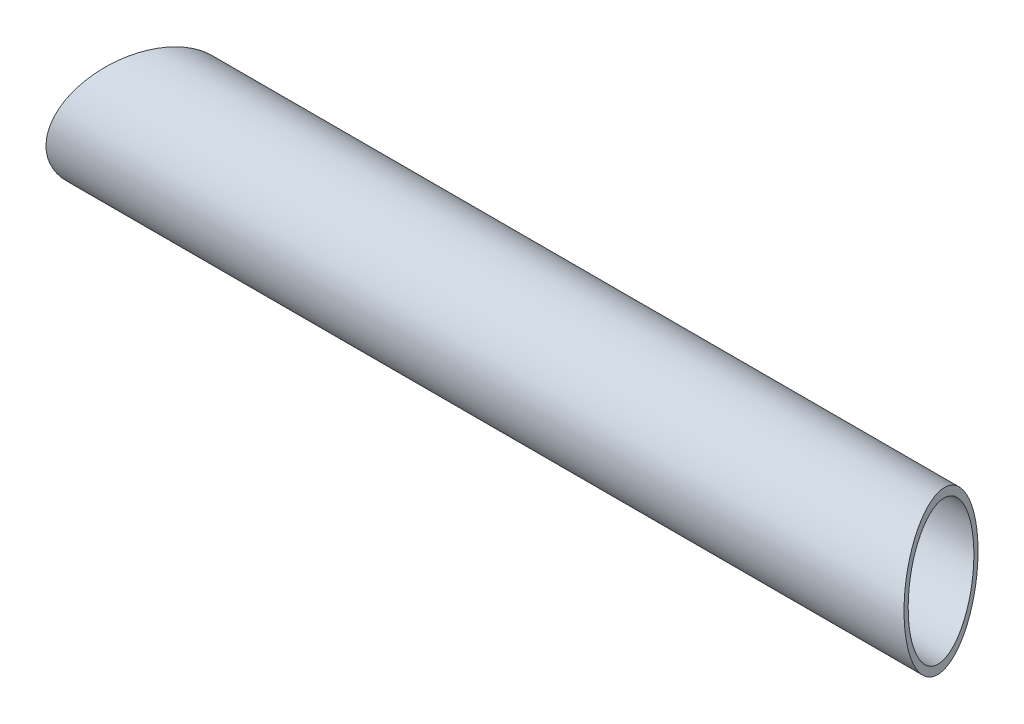
ISO-10303-21;
HEADER;
FILE_DESCRIPTION(('STEP AP214'),'2;1');
FILE_NAME('part.step','',(''),(''),'','','');
FILE_SCHEMA(('AUTOMOTIVE_DESIGN { 1 0 10303 214 1 1 1 1 }'));
ENDSEC;
DATA;
#1=APPLICATION_CONTEXT('core data for automotive mechanical design processes');
#2=APPLICATION_PROTOCOL_DEFINITION('international standard','automotive_design',2000,#1);
#3=PRODUCT_CONTEXT('',#1,'mechanical');
#4=PRODUCT('Part','Part','',(#3));
#5=PRODUCT_RELATED_PRODUCT_CATEGORY('part','',(#4));
#6=PRODUCT_DEFINITION_FORMATION('','',#4);
#7=PRODUCT_DEFINITION_CONTEXT('part definition',#1,'design');
#8=PRODUCT_DEFINITION('design','',#6,#7);
#9=PRODUCT_DEFINITION_SHAPE('','',#8);
#10=(LENGTH_UNIT() NAMED_UNIT(*) SI_UNIT(.MILLI.,.METRE.));
#11=(NAMED_UNIT(*) PLANE_ANGLE_UNIT() SI_UNIT($,.RADIAN.));
#12=(NAMED_UNIT(*) SI_UNIT($,.STERADIAN.) SOLID_ANGLE_UNIT());
#13=UNCERTAINTY_MEASURE_WITH_UNIT(LENGTH_MEASURE(1.E-05),#10,'distance_accuracy_value','');
#14=(GEOMETRIC_REPRESENTATION_CONTEXT(3) GLOBAL_UNCERTAINTY_ASSIGNED_CONTEXT((#13)) GLOBAL_UNIT_ASSIGNED_CONTEXT((#10,
#11,#12)) REPRESENTATION_CONTEXT('',''));
#15=CARTESIAN_POINT('',(0.,0.,0.));
#16=DIRECTION('',(0.,0.,1.));
#17=DIRECTION('',(1.,0.,0.));
#18=AXIS2_PLACEMENT_3D('',#15,#16,#17);
#19=CARTESIAN_POINT('',(-50.,130.,0.));
#20=DIRECTION('',(1.,0.,0.));
#21=DIRECTION('',(0.,1.,0.));
#22=AXIS2_PLACEMENT_3D('',#19,#20,#21);
#23=CYLINDRICAL_SURFACE('',#22,7.1);
#24=CARTESIAN_POINT('',(-50.,130.,0.));
#25=DIRECTION('',(-0.904650427063292,0.140780299510551,-0.402229427173004));
#26=DIRECTION('',(0.426154437750217,0.298851652810821,-0.853861865173774));
#27=AXIS2_PLACEMENT_3D('',#24,#25,#26);
#28=ELLIPSE('',#27,7.84833543167416,7.1);
#29=CARTESIAN_POINT('',(-46.6553970268398,132.34548801557,-6.70139433019862));
#30=VERTEX_POINT('',#29);
#31=EDGE_CURVE('E53',#30,#30,#28,.T.);
#32=ORIENTED_EDGE('',*,*,#31,.T.);
#33=EDGE_LOOP('',(#32));
#34=FACE_BOUND('',#33,.T.);
#35=CARTESIAN_POINT('',(50.,130.,0.));
#36=DIRECTION('',(0.904650427063292,0.140780299510552,-0.402229427173004));
#37=DIRECTION('',(0.426154437750217,-0.298851652810821,0.853861865173774));
#38=AXIS2_PLACEMENT_3D('',#35,#36,#37);
#39=ELLIPSE('',#38,7.84833543167416,7.1);
#40=CARTESIAN_POINT('',(53.3446029731603,127.654511984431,6.70139433019881));
#41=VERTEX_POINT('',#40);
#42=EDGE_CURVE('E43',#41,#41,#39,.T.);
#43=ORIENTED_EDGE('',*,*,#42,.T.);
#44=EDGE_LOOP('',(#43));
#45=FACE_BOUND('',#44,.T.);
#46=ADVANCED_FACE('F39',(#34,#45),#23,.F.);
#47=CARTESIAN_POINT('',(-50.,130.,0.));
#48=DIRECTION('',(1.,0.,0.));
#49=DIRECTION('',(0.,1.,0.));
#50=AXIS2_PLACEMENT_3D('',#47,#48,#49);
#51=CYLINDRICAL_SURFACE('',#50,8.);
#52=CARTESIAN_POINT('',(-50.,130.,0.));
#53=DIRECTION('',(-0.904650427063292,0.140780299510551,-0.402229427173004));
#54=DIRECTION('',(0.426154437750217,0.298851652810821,-0.853861865173774));
#55=AXIS2_PLACEMENT_3D('',#52,#53,#54);
#56=ELLIPSE('',#55,8.84319485259061,8.);
#57=CARTESIAN_POINT('',(-46.2314332696787,132.642803397825,-7.55086685092804));
#58=VERTEX_POINT('',#57);
#59=EDGE_CURVE('E47',#58,#58,#56,.T.);
#60=ORIENTED_EDGE('',*,*,#59,.F.);
#61=EDGE_LOOP('',(#60));
#62=FACE_BOUND('',#61,.T.);
#63=CARTESIAN_POINT('',(50.,130.,0.));
#64=DIRECTION('',(0.904650427063292,0.140780299510552,-0.402229427173004));
#65=DIRECTION('',(0.426154437750217,-0.298851652810821,0.853861865173774));
#66=AXIS2_PLACEMENT_3D('',#63,#64,#65);
#67=ELLIPSE('',#66,8.84319485259061,8.);
#68=CARTESIAN_POINT('',(53.7685667303214,127.357196602175,7.55086685092823));
#69=VERTEX_POINT('',#68);
#70=EDGE_CURVE('E10',#69,#69,#67,.T.);
#71=ORIENTED_EDGE('',*,*,#70,.F.);
#72=EDGE_LOOP('',(#71));
#73=FACE_BOUND('',#72,.T.);
#74=ADVANCED_FACE('F67',(#62,#73),#51,.T.);
#75=CARTESIAN_POINT('',(-50.,130.,0.));
#76=DIRECTION('',(-0.904650427063292,0.140780299510551,-0.402229427173004));
#77=DIRECTION('',(-0.406275581998161,0.,0.913750595880548));
#78=AXIS2_PLACEMENT_3D('',#75,#76,#77);
#79=PLANE('',#78);
#80=ORIENTED_EDGE('',*,*,#31,.F.);
#81=EDGE_LOOP('',(#80));
#82=FACE_BOUND('',#81,.T.);
#83=ORIENTED_EDGE('',*,*,#59,.T.);
#84=EDGE_LOOP('',(#83));
#85=FACE_BOUND('',#84,.T.);
#86=ADVANCED_FACE('F62',(#82,#85),#79,.T.);
#87=CARTESIAN_POINT('',(50.,130.,0.));
#88=DIRECTION('',(0.904650427063292,0.140780299510552,-0.402229427173004));
#89=DIRECTION('',(-0.406275581998161,0.,-0.913750595880547));
#90=AXIS2_PLACEMENT_3D('',#87,#88,#89);
#91=PLANE('',#90);
#92=ORIENTED_EDGE('',*,*,#42,.F.);
#93=EDGE_LOOP('',(#92));
#94=FACE_BOUND('',#93,.T.);
#95=ORIENTED_EDGE('',*,*,#70,.T.);
#96=EDGE_LOOP('',(#95));
#97=FACE_BOUND('',#96,.T.);
#98=ADVANCED_FACE('F41',(#94,#97),#91,.T.);
#99=CLOSED_SHELL('',(#46,#74,#86,#98));
#100=MANIFOLD_SOLID_BREP('B2',#99);
#101=ADVANCED_BREP_SHAPE_REPRESENTATION('',(#18,#100),#14);
#102=SHAPE_DEFINITION_REPRESENTATION(#9,#101);
ENDSEC;
END-ISO-10303-21;
